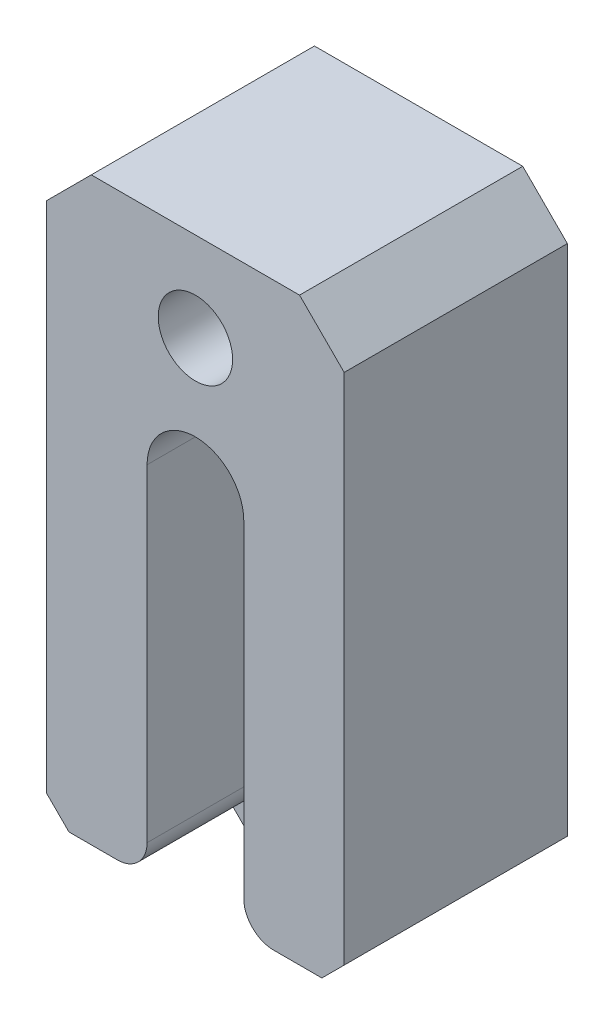
ISO-10303-21;
HEADER;
FILE_DESCRIPTION(('STEP AP214'),'2;1');
FILE_NAME('part.step','',(''),(''),'','','');
FILE_SCHEMA(('AUTOMOTIVE_DESIGN { 1 0 10303 214 1 1 1 1 }'));
ENDSEC;
DATA;
#1=APPLICATION_CONTEXT('core data for automotive mechanical design processes');
#2=APPLICATION_PROTOCOL_DEFINITION('international standard','automotive_design',2000,#1);
#3=PRODUCT_CONTEXT('',#1,'mechanical');
#4=PRODUCT('Part','Part','',(#3));
#5=PRODUCT_RELATED_PRODUCT_CATEGORY('part','',(#4));
#6=PRODUCT_DEFINITION_FORMATION('','',#4);
#7=PRODUCT_DEFINITION_CONTEXT('part definition',#1,'design');
#8=PRODUCT_DEFINITION('design','',#6,#7);
#9=PRODUCT_DEFINITION_SHAPE('','',#8);
#10=(LENGTH_UNIT() NAMED_UNIT(*) SI_UNIT(.MILLI.,.METRE.));
#11=(NAMED_UNIT(*) PLANE_ANGLE_UNIT() SI_UNIT($,.RADIAN.));
#12=(NAMED_UNIT(*) SI_UNIT($,.STERADIAN.) SOLID_ANGLE_UNIT());
#13=UNCERTAINTY_MEASURE_WITH_UNIT(LENGTH_MEASURE(1.E-05),#10,'distance_accuracy_value','');
#14=(GEOMETRIC_REPRESENTATION_CONTEXT(3) GLOBAL_UNCERTAINTY_ASSIGNED_CONTEXT((#13)) GLOBAL_UNIT_ASSIGNED_CONTEXT((#10,
#11,#12)) REPRESENTATION_CONTEXT('',''));
#15=CARTESIAN_POINT('',(0.,0.,0.));
#16=DIRECTION('',(0.,0.,1.));
#17=DIRECTION('',(1.,0.,0.));
#18=AXIS2_PLACEMENT_3D('',#15,#16,#17);
#19=CARTESIAN_POINT('',(10.,12.,0.));
#20=DIRECTION('',(0.,0.,1.));
#21=DIRECTION('',(1.,0.,0.));
#22=AXIS2_PLACEMENT_3D('',#19,#20,#21);
#23=CYLINDRICAL_SURFACE('',#22,3.25);
#24=CARTESIAN_POINT('',(10.,12.,6.));
#25=DIRECTION('',(0.,0.,1.));
#26=DIRECTION('',(1.,0.,0.));
#27=AXIS2_PLACEMENT_3D('',#24,#25,#26);
#28=CIRCLE('',#27,3.25);
#29=CARTESIAN_POINT('',(13.25,12.,6.));
#30=VERTEX_POINT('',#29);
#31=CARTESIAN_POINT('',(6.75,12.,6.));
#32=VERTEX_POINT('',#31);
#33=EDGE_CURVE('E160',#30,#32,#28,.F.);
#34=ORIENTED_EDGE('',*,*,#33,.F.);
#35=DIRECTION('',(0.,0.,1.));
#36=VECTOR('',#35,1.);
#37=CARTESIAN_POINT('',(13.25,12.,0.));
#38=LINE('',#37,#36);
#39=CARTESIAN_POINT('',(13.25,12.,0.));
#40=VERTEX_POINT('',#39);
#41=EDGE_CURVE('E198',#40,#30,#38,.T.);
#42=ORIENTED_EDGE('',*,*,#41,.F.);
#43=CARTESIAN_POINT('',(10.,12.,0.));
#44=DIRECTION('',(0.,0.,1.));
#45=DIRECTION('',(1.,0.,0.));
#46=AXIS2_PLACEMENT_3D('',#43,#44,#45);
#47=CIRCLE('',#46,3.25);
#48=CARTESIAN_POINT('',(6.75,12.,0.));
#49=VERTEX_POINT('',#48);
#50=EDGE_CURVE('E183',#49,#40,#47,.T.);
#51=ORIENTED_EDGE('',*,*,#50,.F.);
#52=DIRECTION('',(0.,0.,1.));
#53=VECTOR('',#52,1.);
#54=CARTESIAN_POINT('',(6.75,12.,0.));
#55=LINE('',#54,#53);
#56=EDGE_CURVE('E177',#49,#32,#55,.T.);
#57=ORIENTED_EDGE('',*,*,#56,.T.);
#58=EDGE_LOOP('',(#34,#42,#51,#57));
#59=FACE_BOUND('',#58,.T.);
#60=ADVANCED_FACE('F32',(#59),#23,.F.);
#61=CARTESIAN_POINT('',(0.,6.,6.));
#62=DIRECTION('',(0.,1.,0.));
#63=DIRECTION('',(0.,0.,1.));
#64=AXIS2_PLACEMENT_3D('',#61,#62,#63);
#65=PLANE('',#64);
#66=DIRECTION('',(-1.,0.,0.));
#67=VECTOR('',#66,1.);
#68=CARTESIAN_POINT('',(0.,6.,6.));
#69=LINE('',#68,#67);
#70=CARTESIAN_POINT('',(4.75,6.,6.));
#71=VERTEX_POINT('',#70);
#72=CARTESIAN_POINT('',(1.5,6.,6.));
#73=VERTEX_POINT('',#72);
#74=EDGE_CURVE('E288',#71,#73,#69,.T.);
#75=ORIENTED_EDGE('',*,*,#74,.F.);
#76=DIRECTION('',(0.,0.,1.));
#77=VECTOR('',#76,1.);
#78=CARTESIAN_POINT('',(4.75,6.,6.));
#79=LINE('',#78,#77);
#80=CARTESIAN_POINT('',(4.75,6.,15.));
#81=VERTEX_POINT('',#80);
#82=EDGE_CURVE('E229',#71,#81,#79,.T.);
#83=ORIENTED_EDGE('',*,*,#82,.T.);
#84=DIRECTION('',(-1.,0.,0.));
#85=VECTOR('',#84,1.);
#86=CARTESIAN_POINT('',(0.,6.,15.));
#87=LINE('',#86,#85);
#88=CARTESIAN_POINT('',(1.5,6.,15.));
#89=VERTEX_POINT('',#88);
#90=EDGE_CURVE('E285',#81,#89,#87,.T.);
#91=ORIENTED_EDGE('',*,*,#90,.T.);
#92=DIRECTION('',(0.,0.,-1.));
#93=VECTOR('',#92,1.);
#94=CARTESIAN_POINT('',(1.5,6.,6.));
#95=LINE('',#94,#93);
#96=EDGE_CURVE('E271',#89,#73,#95,.T.);
#97=ORIENTED_EDGE('',*,*,#96,.T.);
#98=EDGE_LOOP('',(#75,#83,#91,#97));
#99=FACE_BOUND('',#98,.T.);
#100=ADVANCED_FACE('F321',(#99),#65,.F.);
#101=CARTESIAN_POINT('',(0.,0.,15.));
#102=DIRECTION('',(1.,0.,0.));
#103=DIRECTION('',(0.,0.,-1.));
#104=AXIS2_PLACEMENT_3D('',#101,#102,#103);
#105=PLANE('',#104);
#106=DIRECTION('',(0.,-1.,0.));
#107=VECTOR('',#106,1.);
#108=CARTESIAN_POINT('',(0.,0.,15.));
#109=LINE('',#108,#107);
#110=CARTESIAN_POINT('',(0.,42.,15.));
#111=VERTEX_POINT('',#110);
#112=CARTESIAN_POINT('',(0.,7.5,15.));
#113=VERTEX_POINT('',#112);
#114=EDGE_CURVE('E201',#111,#113,#109,.T.);
#115=ORIENTED_EDGE('',*,*,#114,.F.);
#116=DIRECTION('',(0.,0.,-1.));
#117=VECTOR('',#116,1.);
#118=CARTESIAN_POINT('',(0.,42.,15.));
#119=LINE('',#118,#117);
#120=CARTESIAN_POINT('',(0.,42.,0.));
#121=VERTEX_POINT('',#120);
#122=EDGE_CURVE('E11',#111,#121,#119,.T.);
#123=ORIENTED_EDGE('',*,*,#122,.T.);
#124=DIRECTION('',(0.,-1.,0.));
#125=VECTOR('',#124,1.);
#126=CARTESIAN_POINT('',(0.,0.,0.));
#127=LINE('',#126,#125);
#128=CARTESIAN_POINT('',(0.,7.5,0.));
#129=VERTEX_POINT('',#128);
#130=EDGE_CURVE('E185',#121,#129,#127,.T.);
#131=ORIENTED_EDGE('',*,*,#130,.T.);
#132=DIRECTION('',(0.,0.,1.));
#133=VECTOR('',#132,1.);
#134=CARTESIAN_POINT('',(0.,7.5,0.));
#135=LINE('',#134,#133);
#136=EDGE_CURVE('E268',#129,#113,#135,.T.);
#137=ORIENTED_EDGE('',*,*,#136,.T.);
#138=EDGE_LOOP('',(#115,#123,#131,#137));
#139=FACE_BOUND('',#138,.T.);
#140=ADVANCED_FACE('F372',(#139),#105,.F.);
#141=CARTESIAN_POINT('',(0.,0.,15.));
#142=DIRECTION('',(0.,1.,0.));
#143=DIRECTION('',(0.,0.,1.));
#144=AXIS2_PLACEMENT_3D('',#141,#142,#143);
#145=PLANE('',#144);
#146=DIRECTION('',(1.,0.,0.));
#147=VECTOR('',#146,1.);
#148=CARTESIAN_POINT('',(0.,0.,0.));
#149=LINE('',#148,#147);
#150=CARTESIAN_POINT('',(7.5,0.,0.));
#151=VERTEX_POINT('',#150);
#152=CARTESIAN_POINT('',(12.5,0.,0.));
#153=VERTEX_POINT('',#152);
#154=EDGE_CURVE('E188',#151,#153,#149,.T.);
#155=ORIENTED_EDGE('',*,*,#154,.T.);
#156=DIRECTION('',(0.,0.,1.));
#157=VECTOR('',#156,1.);
#158=CARTESIAN_POINT('',(12.5,0.,0.));
#159=LINE('',#158,#157);
#160=CARTESIAN_POINT('',(12.5,0.,6.));
#161=VERTEX_POINT('',#160);
#162=EDGE_CURVE('E267',#153,#161,#159,.T.);
#163=ORIENTED_EDGE('',*,*,#162,.T.);
#164=DIRECTION('',(1.,0.,0.));
#165=VECTOR('',#164,1.);
#166=CARTESIAN_POINT('',(20.,0.,6.));
#167=LINE('',#166,#165);
#168=CARTESIAN_POINT('',(7.5,0.,6.));
#169=VERTEX_POINT('',#168);
#170=EDGE_CURVE('E286',#169,#161,#167,.T.);
#171=ORIENTED_EDGE('',*,*,#170,.F.);
#172=DIRECTION('',(0.,0.,1.));
#173=VECTOR('',#172,1.);
#174=CARTESIAN_POINT('',(7.5,0.,0.));
#175=LINE('',#174,#173);
#176=EDGE_CURVE('E274',#151,#169,#175,.T.);
#177=ORIENTED_EDGE('',*,*,#176,.F.);
#178=EDGE_LOOP('',(#155,#163,#171,#177));
#179=FACE_BOUND('',#178,.T.);
#180=ADVANCED_FACE('F341',(#179),#145,.F.);
#181=CARTESIAN_POINT('',(20.,0.,15.));
#182=DIRECTION('',(-1.,0.,0.));
#183=DIRECTION('',(0.,0.,1.));
#184=AXIS2_PLACEMENT_3D('',#181,#182,#183);
#185=PLANE('',#184);
#186=DIRECTION('',(0.,1.,0.));
#187=VECTOR('',#186,1.);
#188=CARTESIAN_POINT('',(20.,0.,0.));
#189=LINE('',#188,#187);
#190=CARTESIAN_POINT('',(20.,7.5,0.));
#191=VERTEX_POINT('',#190);
#192=CARTESIAN_POINT('',(20.,42.,0.));
#193=VERTEX_POINT('',#192);
#194=EDGE_CURVE('E211',#191,#193,#189,.T.);
#195=ORIENTED_EDGE('',*,*,#194,.T.);
#196=DIRECTION('',(0.,0.,1.));
#197=VECTOR('',#196,1.);
#198=CARTESIAN_POINT('',(20.,42.,15.));
#199=LINE('',#198,#197);
#200=CARTESIAN_POINT('',(20.,42.,15.));
#201=VERTEX_POINT('',#200);
#202=EDGE_CURVE('E55',#193,#201,#199,.T.);
#203=ORIENTED_EDGE('',*,*,#202,.T.);
#204=DIRECTION('',(0.,1.,0.));
#205=VECTOR('',#204,1.);
#206=CARTESIAN_POINT('',(20.,0.,15.));
#207=LINE('',#206,#205);
#208=CARTESIAN_POINT('',(20.,7.5,15.));
#209=VERTEX_POINT('',#208);
#210=EDGE_CURVE('E203',#209,#201,#207,.T.);
#211=ORIENTED_EDGE('',*,*,#210,.F.);
#212=DIRECTION('',(0.,0.,1.));
#213=VECTOR('',#212,1.);
#214=CARTESIAN_POINT('',(20.,7.5,0.));
#215=LINE('',#214,#213);
#216=EDGE_CURVE('E265',#191,#209,#215,.T.);
#217=ORIENTED_EDGE('',*,*,#216,.F.);
#218=EDGE_LOOP('',(#195,#203,#211,#217));
#219=FACE_BOUND('',#218,.T.);
#220=ADVANCED_FACE('F264',(#219),#185,.F.);
#221=CARTESIAN_POINT('',(0.,45.,15.));
#222=DIRECTION('',(0.,-1.,0.));
#223=DIRECTION('',(0.,0.,-1.));
#224=AXIS2_PLACEMENT_3D('',#221,#222,#223);
#225=PLANE('',#224);
#226=DIRECTION('',(-1.,0.,0.));
#227=VECTOR('',#226,1.);
#228=CARTESIAN_POINT('',(0.,45.,15.));
#229=LINE('',#228,#227);
#230=CARTESIAN_POINT('',(17.,45.,15.));
#231=VERTEX_POINT('',#230);
#232=CARTESIAN_POINT('',(3.00000000000001,45.,15.));
#233=VERTEX_POINT('',#232);
#234=EDGE_CURVE('E206',#231,#233,#229,.T.);
#235=ORIENTED_EDGE('',*,*,#234,.F.);
#236=DIRECTION('',(0.,0.,-1.));
#237=VECTOR('',#236,1.);
#238=CARTESIAN_POINT('',(17.,45.,15.));
#239=LINE('',#238,#237);
#240=CARTESIAN_POINT('',(17.,45.,0.));
#241=VERTEX_POINT('',#240);
#242=EDGE_CURVE('E239',#231,#241,#239,.T.);
#243=ORIENTED_EDGE('',*,*,#242,.T.);
#244=DIRECTION('',(-1.,0.,0.));
#245=VECTOR('',#244,1.);
#246=CARTESIAN_POINT('',(0.,45.,0.));
#247=LINE('',#246,#245);
#248=CARTESIAN_POINT('',(3.00000000000002,45.,0.));
#249=VERTEX_POINT('',#248);
#250=EDGE_CURVE('E204',#241,#249,#247,.T.);
#251=ORIENTED_EDGE('',*,*,#250,.T.);
#252=DIRECTION('',(0.,0.,1.));
#253=VECTOR('',#252,1.);
#254=CARTESIAN_POINT('',(3.00000000000002,45.,15.));
#255=LINE('',#254,#253);
#256=EDGE_CURVE('E237',#249,#233,#255,.T.);
#257=ORIENTED_EDGE('',*,*,#256,.T.);
#258=EDGE_LOOP('',(#235,#243,#251,#257));
#259=FACE_BOUND('',#258,.T.);
#260=ADVANCED_FACE('F254',(#259),#225,.F.);
#261=CARTESIAN_POINT('',(0.,0.,15.));
#262=DIRECTION('',(0.,0.,-1.));
#263=DIRECTION('',(-1.,0.,0.));
#264=AXIS2_PLACEMENT_3D('',#261,#262,#263);
#265=PLANE('',#264);
#266=CARTESIAN_POINT('',(10.,39.,15.));
#267=DIRECTION('',(0.,0.,1.));
#268=DIRECTION('',(1.,0.,0.));
#269=AXIS2_PLACEMENT_3D('',#266,#267,#268);
#270=CIRCLE('',#269,2.5);
#271=CARTESIAN_POINT('',(12.5,39.,15.));
#272=VERTEX_POINT('',#271);
#273=EDGE_CURVE('E293',#272,#272,#270,.T.);
#274=ORIENTED_EDGE('',*,*,#273,.F.);
#275=EDGE_LOOP('',(#274));
#276=FACE_BOUND('',#275,.T.);
#277=ORIENTED_EDGE('',*,*,#210,.T.);
#278=DIRECTION('',(0.707106781186547,-0.707106781186548,0.));
#279=VECTOR('',#278,1.);
#280=CARTESIAN_POINT('',(17.,45.,15.));
#281=LINE('',#280,#279);
#282=EDGE_CURVE('E40',#201,#231,#281,.F.);
#283=ORIENTED_EDGE('',*,*,#282,.T.);
#284=ORIENTED_EDGE('',*,*,#234,.T.);
#285=DIRECTION('',(0.707106781186549,0.707106781186546,0.));
#286=VECTOR('',#285,1.);
#287=CARTESIAN_POINT('',(0.,42.,15.));
#288=LINE('',#287,#286);
#289=EDGE_CURVE('E47',#233,#111,#288,.F.);
#290=ORIENTED_EDGE('',*,*,#289,.T.);
#291=ORIENTED_EDGE('',*,*,#114,.T.);
#292=DIRECTION('',(-0.707106781186548,0.707106781186547,0.));
#293=VECTOR('',#292,1.);
#294=CARTESIAN_POINT('',(7.5,0.,15.));
#295=LINE('',#294,#293);
#296=EDGE_CURVE('E171',#89,#113,#295,.T.);
#297=ORIENTED_EDGE('',*,*,#296,.F.);
#298=ORIENTED_EDGE('',*,*,#90,.F.);
#299=CARTESIAN_POINT('',(4.75,8.,15.));
#300=DIRECTION('',(0.,0.,-1.));
#301=DIRECTION('',(-1.,0.,0.));
#302=AXIS2_PLACEMENT_3D('',#299,#300,#301);
#303=CIRCLE('',#302,2.);
#304=CARTESIAN_POINT('',(6.75,8.,15.));
#305=VERTEX_POINT('',#304);
#306=EDGE_CURVE('E223',#81,#305,#303,.F.);
#307=ORIENTED_EDGE('',*,*,#306,.T.);
#308=DIRECTION('',(0.,-1.,0.));
#309=VECTOR('',#308,1.);
#310=CARTESIAN_POINT('',(6.75,12.,15.));
#311=LINE('',#310,#309);
#312=CARTESIAN_POINT('',(6.75,30.,15.));
#313=VERTEX_POINT('',#312);
#314=EDGE_CURVE('E193',#313,#305,#311,.T.);
#315=ORIENTED_EDGE('',*,*,#314,.F.);
#316=CARTESIAN_POINT('',(10.,30.,15.));
#317=DIRECTION('',(0.,0.,1.));
#318=DIRECTION('',(1.,0.,0.));
#319=AXIS2_PLACEMENT_3D('',#316,#317,#318);
#320=CIRCLE('',#319,3.25);
#321=CARTESIAN_POINT('',(13.25,30.,15.));
#322=VERTEX_POINT('',#321);
#323=EDGE_CURVE('E310',#322,#313,#320,.T.);
#324=ORIENTED_EDGE('',*,*,#323,.F.);
#325=DIRECTION('',(0.,1.,0.));
#326=VECTOR('',#325,1.);
#327=CARTESIAN_POINT('',(13.25,12.,15.));
#328=LINE('',#327,#326);
#329=CARTESIAN_POINT('',(13.25,8.,15.));
#330=VERTEX_POINT('',#329);
#331=EDGE_CURVE('E299',#330,#322,#328,.T.);
#332=ORIENTED_EDGE('',*,*,#331,.F.);
#333=CARTESIAN_POINT('',(15.25,8.,15.));
#334=DIRECTION('',(0.,0.,-1.));
#335=DIRECTION('',(-1.,0.,0.));
#336=AXIS2_PLACEMENT_3D('',#333,#334,#335);
#337=CIRCLE('',#336,2.);
#338=CARTESIAN_POINT('',(15.25,6.,15.));
#339=VERTEX_POINT('',#338);
#340=EDGE_CURVE('E225',#330,#339,#337,.F.);
#341=ORIENTED_EDGE('',*,*,#340,.T.);
#342=CARTESIAN_POINT('',(18.5,6.,15.));
#343=VERTEX_POINT('',#342);
#344=EDGE_CURVE('E289',#343,#339,#87,.T.);
#345=ORIENTED_EDGE('',*,*,#344,.F.);
#346=DIRECTION('',(-0.707106781186548,-0.707106781186547,0.));
#347=VECTOR('',#346,1.);
#348=CARTESIAN_POINT('',(20.,7.5,15.));
#349=LINE('',#348,#347);
#350=EDGE_CURVE('E329',#209,#343,#349,.T.);
#351=ORIENTED_EDGE('',*,*,#350,.F.);
#352=EDGE_LOOP('',(#277,#283,#284,#290,#291,#297,#298,#307,#315,#324,#332,#341,#345,#351));
#353=FACE_BOUND('',#352,.T.);
#354=ADVANCED_FACE('F249',(#276,#353),#265,.F.);
#355=CARTESIAN_POINT('',(0.,0.,0.));
#356=DIRECTION('',(0.,0.,-1.));
#357=DIRECTION('',(-1.,0.,0.));
#358=AXIS2_PLACEMENT_3D('',#355,#356,#357);
#359=PLANE('',#358);
#360=ORIENTED_EDGE('',*,*,#250,.F.);
#361=DIRECTION('',(-0.707106781186547,0.707106781186548,0.));
#362=VECTOR('',#361,1.);
#363=CARTESIAN_POINT('',(31.,30.9999999999999,0.));
#364=LINE('',#363,#362);
#365=EDGE_CURVE('E244',#241,#193,#364,.F.);
#366=ORIENTED_EDGE('',*,*,#365,.T.);
#367=ORIENTED_EDGE('',*,*,#194,.F.);
#368=DIRECTION('',(-0.707106781186548,-0.707106781186547,0.));
#369=VECTOR('',#368,1.);
#370=CARTESIAN_POINT('',(20.,7.5,0.));
#371=LINE('',#370,#369);
#372=EDGE_CURVE('E279',#191,#153,#371,.T.);
#373=ORIENTED_EDGE('',*,*,#372,.T.);
#374=ORIENTED_EDGE('',*,*,#154,.F.);
#375=DIRECTION('',(-0.707106781186548,0.707106781186547,0.));
#376=VECTOR('',#375,1.);
#377=CARTESIAN_POINT('',(7.5,0.,0.));
#378=LINE('',#377,#376);
#379=EDGE_CURVE('E331',#151,#129,#378,.T.);
#380=ORIENTED_EDGE('',*,*,#379,.T.);
#381=ORIENTED_EDGE('',*,*,#130,.F.);
#382=DIRECTION('',(-0.707106781186549,-0.707106781186546,0.));
#383=VECTOR('',#382,1.);
#384=CARTESIAN_POINT('',(-21.,21.0000000000001,0.));
#385=LINE('',#384,#383);
#386=EDGE_CURVE('E242',#121,#249,#385,.F.);
#387=ORIENTED_EDGE('',*,*,#386,.T.);
#388=EDGE_LOOP('',(#360,#366,#367,#373,#374,#380,#381,#387));
#389=FACE_BOUND('',#388,.T.);
#390=CARTESIAN_POINT('',(10.,39.,0.));
#391=DIRECTION('',(0.,0.,1.));
#392=DIRECTION('',(1.,0.,0.));
#393=AXIS2_PLACEMENT_3D('',#390,#391,#392);
#394=CIRCLE('',#393,2.5);
#395=CARTESIAN_POINT('',(12.5,39.,0.));
#396=VERTEX_POINT('',#395);
#397=EDGE_CURVE('E296',#396,#396,#394,.T.);
#398=ORIENTED_EDGE('',*,*,#397,.T.);
#399=EDGE_LOOP('',(#398));
#400=FACE_BOUND('',#399,.T.);
#401=ORIENTED_EDGE('',*,*,#50,.T.);
#402=DIRECTION('',(0.,1.,0.));
#403=VECTOR('',#402,1.);
#404=CARTESIAN_POINT('',(13.25,12.,0.));
#405=LINE('',#404,#403);
#406=CARTESIAN_POINT('',(13.25,30.,0.));
#407=VERTEX_POINT('',#406);
#408=EDGE_CURVE('E303',#40,#407,#405,.T.);
#409=ORIENTED_EDGE('',*,*,#408,.T.);
#410=CARTESIAN_POINT('',(10.,30.,0.));
#411=DIRECTION('',(0.,0.,1.));
#412=DIRECTION('',(1.,0.,0.));
#413=AXIS2_PLACEMENT_3D('',#410,#411,#412);
#414=CIRCLE('',#413,3.25);
#415=CARTESIAN_POINT('',(6.75,30.,0.));
#416=VERTEX_POINT('',#415);
#417=EDGE_CURVE('E306',#407,#416,#414,.T.);
#418=ORIENTED_EDGE('',*,*,#417,.T.);
#419=DIRECTION('',(0.,-1.,0.));
#420=VECTOR('',#419,1.);
#421=CARTESIAN_POINT('',(6.75,12.,0.));
#422=LINE('',#421,#420);
#423=EDGE_CURVE('E200',#416,#49,#422,.T.);
#424=ORIENTED_EDGE('',*,*,#423,.T.);
#425=EDGE_LOOP('',(#401,#409,#418,#424));
#426=FACE_BOUND('',#425,.T.);
#427=ADVANCED_FACE('F260',(#389,#400,#426),#359,.T.);
#428=CARTESIAN_POINT('',(6.75,12.,0.));
#429=DIRECTION('',(-1.,0.,0.));
#430=DIRECTION('',(0.,0.,1.));
#431=AXIS2_PLACEMENT_3D('',#428,#429,#430);
#432=PLANE('',#431);
#433=ORIENTED_EDGE('',*,*,#314,.T.);
#434=DIRECTION('',(0.,0.,1.));
#435=VECTOR('',#434,1.);
#436=CARTESIAN_POINT('',(6.75,8.,0.));
#437=LINE('',#436,#435);
#438=CARTESIAN_POINT('',(6.75,8.,6.));
#439=VERTEX_POINT('',#438);
#440=EDGE_CURVE('E180',#305,#439,#437,.F.);
#441=ORIENTED_EDGE('',*,*,#440,.T.);
#442=DIRECTION('',(0.,-1.,0.));
#443=VECTOR('',#442,1.);
#444=CARTESIAN_POINT('',(6.75,14.,6.));
#445=LINE('',#444,#443);
#446=EDGE_CURVE('E164',#32,#439,#445,.T.);
#447=ORIENTED_EDGE('',*,*,#446,.F.);
#448=ORIENTED_EDGE('',*,*,#56,.F.);
#449=ORIENTED_EDGE('',*,*,#423,.F.);
#450=DIRECTION('',(0.,0.,1.));
#451=VECTOR('',#450,1.);
#452=CARTESIAN_POINT('',(6.75,30.,0.));
#453=LINE('',#452,#451);
#454=EDGE_CURVE('E186',#416,#313,#453,.T.);
#455=ORIENTED_EDGE('',*,*,#454,.T.);
#456=EDGE_LOOP('',(#433,#441,#447,#448,#449,#455));
#457=FACE_BOUND('',#456,.T.);
#458=ADVANCED_FACE('F175',(#457),#432,.F.);
#459=CARTESIAN_POINT('',(10.,30.,0.));
#460=DIRECTION('',(0.,0.,1.));
#461=DIRECTION('',(1.,0.,0.));
#462=AXIS2_PLACEMENT_3D('',#459,#460,#461);
#463=CYLINDRICAL_SURFACE('',#462,3.25);
#464=ORIENTED_EDGE('',*,*,#323,.T.);
#465=ORIENTED_EDGE('',*,*,#454,.F.);
#466=ORIENTED_EDGE('',*,*,#417,.F.);
#467=DIRECTION('',(0.,0.,1.));
#468=VECTOR('',#467,1.);
#469=CARTESIAN_POINT('',(13.25,30.,0.));
#470=LINE('',#469,#468);
#471=EDGE_CURVE('E190',#407,#322,#470,.T.);
#472=ORIENTED_EDGE('',*,*,#471,.T.);
#473=EDGE_LOOP('',(#464,#465,#466,#472));
#474=FACE_BOUND('',#473,.T.);
#475=ADVANCED_FACE('F357',(#474),#463,.F.);
#476=CARTESIAN_POINT('',(13.25,12.,0.));
#477=DIRECTION('',(1.,0.,0.));
#478=DIRECTION('',(0.,0.,-1.));
#479=AXIS2_PLACEMENT_3D('',#476,#477,#478);
#480=PLANE('',#479);
#481=DIRECTION('',(0.,1.,0.));
#482=VECTOR('',#481,1.);
#483=CARTESIAN_POINT('',(13.25,14.,6.));
#484=LINE('',#483,#482);
#485=CARTESIAN_POINT('',(13.25,8.,6.));
#486=VERTEX_POINT('',#485);
#487=EDGE_CURVE('E167',#486,#30,#484,.T.);
#488=ORIENTED_EDGE('',*,*,#487,.F.);
#489=DIRECTION('',(0.,0.,1.));
#490=VECTOR('',#489,1.);
#491=CARTESIAN_POINT('',(13.25,8.,0.));
#492=LINE('',#491,#490);
#493=EDGE_CURVE('E220',#486,#330,#492,.T.);
#494=ORIENTED_EDGE('',*,*,#493,.T.);
#495=ORIENTED_EDGE('',*,*,#331,.T.);
#496=ORIENTED_EDGE('',*,*,#471,.F.);
#497=ORIENTED_EDGE('',*,*,#408,.F.);
#498=ORIENTED_EDGE('',*,*,#41,.T.);
#499=EDGE_LOOP('',(#488,#494,#495,#496,#497,#498));
#500=FACE_BOUND('',#499,.T.);
#501=ADVANCED_FACE('F352',(#500),#480,.F.);
#502=CARTESIAN_POINT('',(10.,39.,0.));
#503=DIRECTION('',(0.,0.,1.));
#504=DIRECTION('',(1.,0.,0.));
#505=AXIS2_PLACEMENT_3D('',#502,#503,#504);
#506=CYLINDRICAL_SURFACE('',#505,2.5);
#507=ORIENTED_EDGE('',*,*,#397,.F.);
#508=EDGE_LOOP('',(#507));
#509=FACE_BOUND('',#508,.T.);
#510=ORIENTED_EDGE('',*,*,#273,.T.);
#511=EDGE_LOOP('',(#510));
#512=FACE_BOUND('',#511,.T.);
#513=ADVANCED_FACE('F468',(#509,#512),#506,.F.);
#514=ORIENTED_EDGE('',*,*,#344,.T.);
#515=DIRECTION('',(0.,0.,1.));
#516=VECTOR('',#515,1.);
#517=CARTESIAN_POINT('',(15.25,6.,6.));
#518=LINE('',#517,#516);
#519=CARTESIAN_POINT('',(15.25,6.,6.));
#520=VERTEX_POINT('',#519);
#521=EDGE_CURVE('E227',#339,#520,#518,.F.);
#522=ORIENTED_EDGE('',*,*,#521,.T.);
#523=CARTESIAN_POINT('',(18.5,6.,6.));
#524=VERTEX_POINT('',#523);
#525=EDGE_CURVE('E290',#524,#520,#69,.T.);
#526=ORIENTED_EDGE('',*,*,#525,.F.);
#527=DIRECTION('',(0.,0.,1.));
#528=VECTOR('',#527,1.);
#529=CARTESIAN_POINT('',(18.5,6.,6.));
#530=LINE('',#529,#528);
#531=EDGE_CURVE('E282',#524,#343,#530,.T.);
#532=ORIENTED_EDGE('',*,*,#531,.T.);
#533=EDGE_LOOP('',(#514,#522,#526,#532));
#534=FACE_BOUND('',#533,.T.);
#535=ADVANCED_FACE('F345',(#534),#65,.F.);
#536=CARTESIAN_POINT('',(0.,0.,6.));
#537=DIRECTION('',(0.,0.,-1.));
#538=DIRECTION('',(-1.,0.,0.));
#539=AXIS2_PLACEMENT_3D('',#536,#537,#538);
#540=PLANE('',#539);
#541=ORIENTED_EDGE('',*,*,#170,.T.);
#542=DIRECTION('',(0.707106781186548,0.707106781186547,0.));
#543=VECTOR('',#542,1.);
#544=CARTESIAN_POINT('',(6.25,-6.25,6.));
#545=LINE('',#544,#543);
#546=EDGE_CURVE('E217',#161,#524,#545,.T.);
#547=ORIENTED_EDGE('',*,*,#546,.T.);
#548=ORIENTED_EDGE('',*,*,#525,.T.);
#549=CARTESIAN_POINT('',(15.25,8.,6.));
#550=DIRECTION('',(0.,0.,-1.));
#551=DIRECTION('',(-1.,0.,0.));
#552=AXIS2_PLACEMENT_3D('',#549,#550,#551);
#553=CIRCLE('',#552,2.);
#554=EDGE_CURVE('E233',#520,#486,#553,.T.);
#555=ORIENTED_EDGE('',*,*,#554,.T.);
#556=ORIENTED_EDGE('',*,*,#487,.T.);
#557=ORIENTED_EDGE('',*,*,#33,.T.);
#558=ORIENTED_EDGE('',*,*,#446,.T.);
#559=CARTESIAN_POINT('',(4.75,8.,6.));
#560=DIRECTION('',(0.,0.,-1.));
#561=DIRECTION('',(-1.,0.,0.));
#562=AXIS2_PLACEMENT_3D('',#559,#560,#561);
#563=CIRCLE('',#562,2.);
#564=EDGE_CURVE('E235',#439,#71,#563,.T.);
#565=ORIENTED_EDGE('',*,*,#564,.T.);
#566=ORIENTED_EDGE('',*,*,#74,.T.);
#567=DIRECTION('',(0.707106781186548,-0.707106781186547,0.));
#568=VECTOR('',#567,1.);
#569=CARTESIAN_POINT('',(3.75,3.75,6.));
#570=LINE('',#569,#568);
#571=EDGE_CURVE('E207',#73,#169,#570,.T.);
#572=ORIENTED_EDGE('',*,*,#571,.T.);
#573=EDGE_LOOP('',(#541,#547,#548,#555,#556,#557,#558,#565,#566,#572));
#574=FACE_BOUND('',#573,.T.);
#575=ADVANCED_FACE('F163',(#574),#540,.F.);
#576=CARTESIAN_POINT('',(7.5,0.,0.));
#577=DIRECTION('',(0.707106781186547,0.707106781186548,0.));
#578=DIRECTION('',(-0.707106781186548,0.707106781186547,0.));
#579=AXIS2_PLACEMENT_3D('',#576,#577,#578);
#580=PLANE('',#579);
#581=ORIENTED_EDGE('',*,*,#296,.T.);
#582=ORIENTED_EDGE('',*,*,#136,.F.);
#583=ORIENTED_EDGE('',*,*,#379,.F.);
#584=ORIENTED_EDGE('',*,*,#176,.T.);
#585=ORIENTED_EDGE('',*,*,#571,.F.);
#586=ORIENTED_EDGE('',*,*,#96,.F.);
#587=EDGE_LOOP('',(#581,#582,#583,#584,#585,#586));
#588=FACE_BOUND('',#587,.T.);
#589=ADVANCED_FACE('F327',(#588),#580,.F.);
#590=CARTESIAN_POINT('',(20.,7.5,0.));
#591=DIRECTION('',(-0.707106781186547,0.707106781186548,0.));
#592=DIRECTION('',(-0.707106781186548,-0.707106781186547,0.));
#593=AXIS2_PLACEMENT_3D('',#590,#591,#592);
#594=PLANE('',#593);
#595=ORIENTED_EDGE('',*,*,#546,.F.);
#596=ORIENTED_EDGE('',*,*,#162,.F.);
#597=ORIENTED_EDGE('',*,*,#372,.F.);
#598=ORIENTED_EDGE('',*,*,#216,.T.);
#599=ORIENTED_EDGE('',*,*,#350,.T.);
#600=ORIENTED_EDGE('',*,*,#531,.F.);
#601=EDGE_LOOP('',(#595,#596,#597,#598,#599,#600));
#602=FACE_BOUND('',#601,.T.);
#603=ADVANCED_FACE('F358',(#602),#594,.F.);
#604=CARTESIAN_POINT('',(15.25,8.,0.));
#605=DIRECTION('',(0.,0.,1.));
#606=DIRECTION('',(1.,0.,0.));
#607=AXIS2_PLACEMENT_3D('',#604,#605,#606);
#608=CYLINDRICAL_SURFACE('',#607,2.);
#609=ORIENTED_EDGE('',*,*,#554,.F.);
#610=ORIENTED_EDGE('',*,*,#521,.F.);
#611=ORIENTED_EDGE('',*,*,#340,.F.);
#612=ORIENTED_EDGE('',*,*,#493,.F.);
#613=EDGE_LOOP('',(#609,#610,#611,#612));
#614=FACE_BOUND('',#613,.T.);
#615=ADVANCED_FACE('F349',(#614),#608,.T.);
#616=CARTESIAN_POINT('',(4.75,8.,6.));
#617=DIRECTION('',(0.,0.,1.));
#618=DIRECTION('',(1.,0.,0.));
#619=AXIS2_PLACEMENT_3D('',#616,#617,#618);
#620=CYLINDRICAL_SURFACE('',#619,2.);
#621=ORIENTED_EDGE('',*,*,#564,.F.);
#622=ORIENTED_EDGE('',*,*,#440,.F.);
#623=ORIENTED_EDGE('',*,*,#306,.F.);
#624=ORIENTED_EDGE('',*,*,#82,.F.);
#625=EDGE_LOOP('',(#621,#622,#623,#624));
#626=FACE_BOUND('',#625,.T.);
#627=ADVANCED_FACE('F316',(#626),#620,.T.);
#628=CARTESIAN_POINT('',(17.,45.,15.));
#629=DIRECTION('',(-0.707106781186548,-0.707106781186547,0.));
#630=DIRECTION('',(0.,0.,-1.));
#631=AXIS2_PLACEMENT_3D('',#628,#629,#630);
#632=PLANE('',#631);
#633=ORIENTED_EDGE('',*,*,#282,.F.);
#634=ORIENTED_EDGE('',*,*,#202,.F.);
#635=ORIENTED_EDGE('',*,*,#365,.F.);
#636=ORIENTED_EDGE('',*,*,#242,.F.);
#637=EDGE_LOOP('',(#633,#634,#635,#636));
#638=FACE_BOUND('',#637,.T.);
#639=ADVANCED_FACE('F257',(#638),#632,.F.);
#640=CARTESIAN_POINT('',(0.,42.,15.));
#641=DIRECTION('',(0.707106781186546,-0.707106781186549,0.));
#642=DIRECTION('',(0.,0.,-1.));
#643=AXIS2_PLACEMENT_3D('',#640,#641,#642);
#644=PLANE('',#643);
#645=ORIENTED_EDGE('',*,*,#289,.F.);
#646=ORIENTED_EDGE('',*,*,#256,.F.);
#647=ORIENTED_EDGE('',*,*,#386,.F.);
#648=ORIENTED_EDGE('',*,*,#122,.F.);
#649=EDGE_LOOP('',(#645,#646,#647,#648));
#650=FACE_BOUND('',#649,.T.);
#651=ADVANCED_FACE('F34',(#650),#644,.F.);
#652=CLOSED_SHELL('',(#60,#100,#140,#180,#220,#260,#354,#427,#458,#475,#501,#513,#535,#575,#589,
#603,#615,#627,#639,#651));
#653=MANIFOLD_SOLID_BREP('B2',#652);
#654=ADVANCED_BREP_SHAPE_REPRESENTATION('',(#18,#653),#14);
#655=SHAPE_DEFINITION_REPRESENTATION(#9,#654);
ENDSEC;
END-ISO-10303-21;
